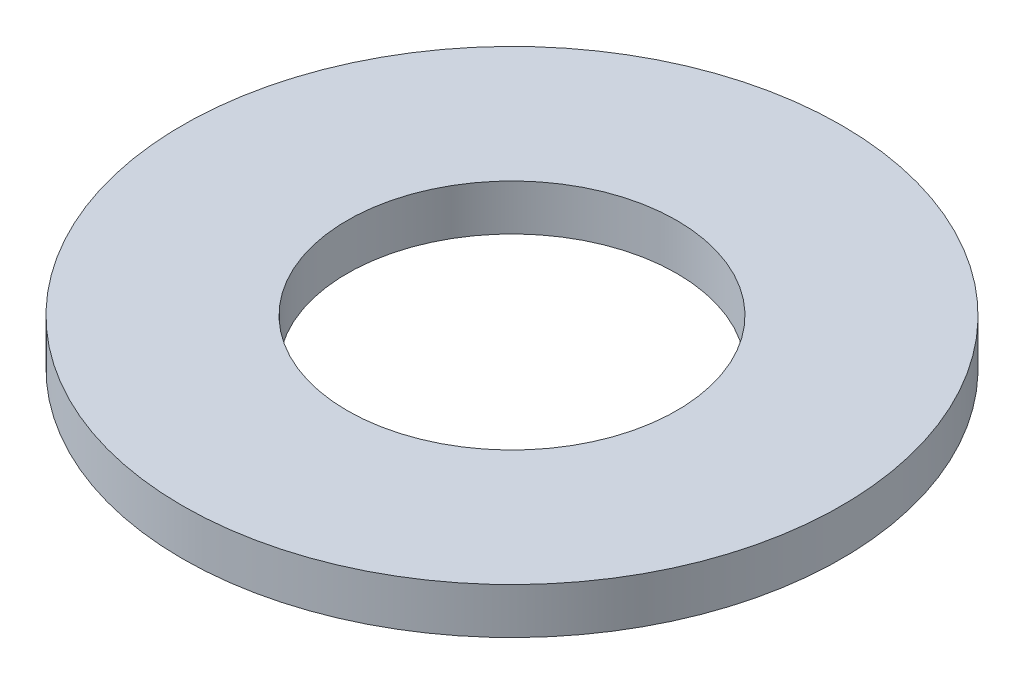
ISO-10303-21;
HEADER;
FILE_DESCRIPTION(('STEP AP214'),'2;1');
FILE_NAME('part.step','',(''),(''),'','','');
FILE_SCHEMA(('AUTOMOTIVE_DESIGN { 1 0 10303 214 1 1 1 1 }'));
ENDSEC;
DATA;
#1=APPLICATION_CONTEXT('core data for automotive mechanical design processes');
#2=APPLICATION_PROTOCOL_DEFINITION('international standard','automotive_design',2000,#1);
#3=PRODUCT_CONTEXT('',#1,'mechanical');
#4=PRODUCT('Part','Part','',(#3));
#5=PRODUCT_RELATED_PRODUCT_CATEGORY('part','',(#4));
#6=PRODUCT_DEFINITION_FORMATION('','',#4);
#7=PRODUCT_DEFINITION_CONTEXT('part definition',#1,'design');
#8=PRODUCT_DEFINITION('design','',#6,#7);
#9=PRODUCT_DEFINITION_SHAPE('','',#8);
#10=(LENGTH_UNIT() NAMED_UNIT(*) SI_UNIT(.MILLI.,.METRE.));
#11=(NAMED_UNIT(*) PLANE_ANGLE_UNIT() SI_UNIT($,.RADIAN.));
#12=(NAMED_UNIT(*) SI_UNIT($,.STERADIAN.) SOLID_ANGLE_UNIT());
#13=UNCERTAINTY_MEASURE_WITH_UNIT(LENGTH_MEASURE(1.E-05),#10,'distance_accuracy_value','');
#14=(GEOMETRIC_REPRESENTATION_CONTEXT(3) GLOBAL_UNCERTAINTY_ASSIGNED_CONTEXT((#13)) GLOBAL_UNIT_ASSIGNED_CONTEXT((#10,
#11,#12)) REPRESENTATION_CONTEXT('',''));
#15=CARTESIAN_POINT('',(0.,0.,0.));
#16=DIRECTION('',(0.,0.,1.));
#17=DIRECTION('',(1.,0.,0.));
#18=AXIS2_PLACEMENT_3D('',#15,#16,#17);
#19=CARTESIAN_POINT('',(0.,1.8796,0.));
#20=DIRECTION('',(0.,1.,0.));
#21=DIRECTION('',(0.,0.,1.));
#22=AXIS2_PLACEMENT_3D('',#19,#20,#21);
#23=PLANE('',#22);
#24=CARTESIAN_POINT('',(0.,1.8796,0.));
#25=DIRECTION('',(0.,1.,0.));
#26=DIRECTION('',(0.,0.,1.));
#27=AXIS2_PLACEMENT_3D('',#24,#25,#26);
#28=CIRCLE('',#27,13.49375);
#29=CARTESIAN_POINT('',(0.,1.8796,13.49375));
#30=VERTEX_POINT('',#29);
#31=EDGE_CURVE('E10',#30,#30,#28,.T.);
#32=ORIENTED_EDGE('',*,*,#31,.T.);
#33=EDGE_LOOP('',(#32));
#34=FACE_BOUND('',#33,.T.);
#35=CARTESIAN_POINT('',(0.,1.8796,0.));
#36=DIRECTION('',(0.,1.,0.));
#37=DIRECTION('',(0.,0.,1.));
#38=AXIS2_PLACEMENT_3D('',#35,#36,#37);
#39=CIRCLE('',#38,6.746875);
#40=CARTESIAN_POINT('',(0.,1.8796,6.746875));
#41=VERTEX_POINT('',#40);
#42=EDGE_CURVE('E41',#41,#41,#39,.T.);
#43=ORIENTED_EDGE('',*,*,#42,.F.);
#44=EDGE_LOOP('',(#43));
#45=FACE_BOUND('',#44,.T.);
#46=ADVANCED_FACE('F30',(#34,#45),#23,.T.);
#47=CARTESIAN_POINT('',(0.,0.,0.));
#48=DIRECTION('',(0.,1.,0.));
#49=DIRECTION('',(0.,0.,1.));
#50=AXIS2_PLACEMENT_3D('',#47,#48,#49);
#51=PLANE('',#50);
#52=CARTESIAN_POINT('',(0.,0.,0.));
#53=DIRECTION('',(0.,1.,0.));
#54=DIRECTION('',(0.,0.,1.));
#55=AXIS2_PLACEMENT_3D('',#52,#53,#54);
#56=CIRCLE('',#55,13.49375);
#57=CARTESIAN_POINT('',(0.,0.,13.49375));
#58=VERTEX_POINT('',#57);
#59=EDGE_CURVE('E34',#58,#58,#56,.T.);
#60=ORIENTED_EDGE('',*,*,#59,.F.);
#61=EDGE_LOOP('',(#60));
#62=FACE_BOUND('',#61,.T.);
#63=CARTESIAN_POINT('',(0.,0.,0.));
#64=DIRECTION('',(0.,1.,0.));
#65=DIRECTION('',(0.,0.,1.));
#66=AXIS2_PLACEMENT_3D('',#63,#64,#65);
#67=CIRCLE('',#66,6.746875);
#68=CARTESIAN_POINT('',(0.,0.,6.746875));
#69=VERTEX_POINT('',#68);
#70=EDGE_CURVE('E43',#69,#69,#67,.T.);
#71=ORIENTED_EDGE('',*,*,#70,.T.);
#72=EDGE_LOOP('',(#71));
#73=FACE_BOUND('',#72,.T.);
#74=ADVANCED_FACE('F53',(#62,#73),#51,.F.);
#75=CARTESIAN_POINT('',(0.,1.8796,0.));
#76=DIRECTION('',(0.,-1.,0.));
#77=DIRECTION('',(0.,0.,-1.));
#78=AXIS2_PLACEMENT_3D('',#75,#76,#77);
#79=CYLINDRICAL_SURFACE('',#78,13.49375);
#80=ORIENTED_EDGE('',*,*,#31,.F.);
#81=EDGE_LOOP('',(#80));
#82=FACE_BOUND('',#81,.T.);
#83=ORIENTED_EDGE('',*,*,#59,.T.);
#84=EDGE_LOOP('',(#83));
#85=FACE_BOUND('',#84,.T.);
#86=ADVANCED_FACE('F32',(#82,#85),#79,.T.);
#87=CARTESIAN_POINT('',(0.,1.8796,0.));
#88=DIRECTION('',(0.,-1.,0.));
#89=DIRECTION('',(0.,0.,-1.));
#90=AXIS2_PLACEMENT_3D('',#87,#88,#89);
#91=CYLINDRICAL_SURFACE('',#90,6.746875);
#92=ORIENTED_EDGE('',*,*,#42,.T.);
#93=EDGE_LOOP('',(#92));
#94=FACE_BOUND('',#93,.T.);
#95=ORIENTED_EDGE('',*,*,#70,.F.);
#96=EDGE_LOOP('',(#95));
#97=FACE_BOUND('',#96,.T.);
#98=ADVANCED_FACE('F49',(#94,#97),#91,.F.);
#99=CLOSED_SHELL('',(#46,#74,#86,#98));
#100=MANIFOLD_SOLID_BREP('B2',#99);
#101=ADVANCED_BREP_SHAPE_REPRESENTATION('',(#18,#100),#14);
#102=SHAPE_DEFINITION_REPRESENTATION(#9,#101);
ENDSEC;
END-ISO-10303-21;
